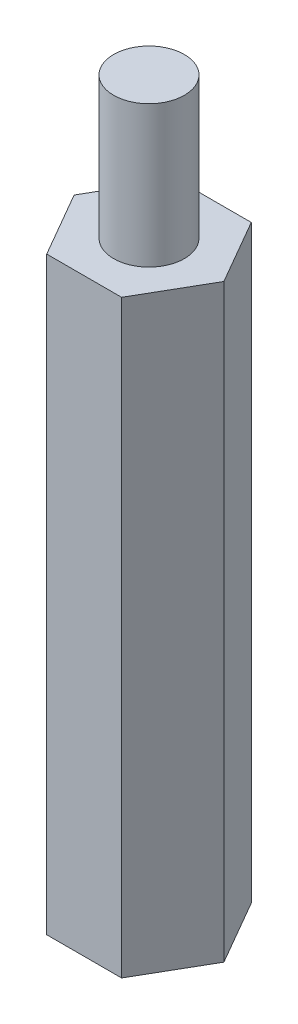
ISO-10303-21;
HEADER;
FILE_DESCRIPTION(('STEP AP214'),'2;1');
FILE_NAME('part.step','',(''),(''),'','','');
FILE_SCHEMA(('AUTOMOTIVE_DESIGN { 1 0 10303 214 1 1 1 1 }'));
ENDSEC;
DATA;
#1=APPLICATION_CONTEXT('core data for automotive mechanical design processes');
#2=APPLICATION_PROTOCOL_DEFINITION('international standard','automotive_design',2000,#1);
#3=PRODUCT_CONTEXT('',#1,'mechanical');
#4=PRODUCT('Part','Part','',(#3));
#5=PRODUCT_RELATED_PRODUCT_CATEGORY('part','',(#4));
#6=PRODUCT_DEFINITION_FORMATION('','',#4);
#7=PRODUCT_DEFINITION_CONTEXT('part definition',#1,'design');
#8=PRODUCT_DEFINITION('design','',#6,#7);
#9=PRODUCT_DEFINITION_SHAPE('','',#8);
#10=(LENGTH_UNIT() NAMED_UNIT(*) SI_UNIT(.MILLI.,.METRE.));
#11=(NAMED_UNIT(*) PLANE_ANGLE_UNIT() SI_UNIT($,.RADIAN.));
#12=(NAMED_UNIT(*) SI_UNIT($,.STERADIAN.) SOLID_ANGLE_UNIT());
#13=UNCERTAINTY_MEASURE_WITH_UNIT(LENGTH_MEASURE(1.E-05),#10,'distance_accuracy_value','');
#14=(GEOMETRIC_REPRESENTATION_CONTEXT(3) GLOBAL_UNCERTAINTY_ASSIGNED_CONTEXT((#13)) GLOBAL_UNIT_ASSIGNED_CONTEXT((#10,
#11,#12)) REPRESENTATION_CONTEXT('',''));
#15=CARTESIAN_POINT('',(0.,0.,0.));
#16=DIRECTION('',(0.,0.,1.));
#17=DIRECTION('',(1.,0.,0.));
#18=AXIS2_PLACEMENT_3D('',#15,#16,#17);
#19=CARTESIAN_POINT('',(0.,25.,0.));
#20=DIRECTION('',(0.,1.,0.));
#21=DIRECTION('',(0.,0.,1.));
#22=AXIS2_PLACEMENT_3D('',#19,#20,#21);
#23=PLANE('',#22);
#24=DIRECTION('',(1.,0.,0.));
#25=VECTOR('',#24,1.);
#26=CARTESIAN_POINT('',(-1.58771324027147,25.,2.75));
#27=LINE('',#26,#25);
#28=CARTESIAN_POINT('',(-1.58771324027147,25.,2.75));
#29=VERTEX_POINT('',#28);
#30=CARTESIAN_POINT('',(1.58771324027147,25.,2.75));
#31=VERTEX_POINT('',#30);
#32=EDGE_CURVE('E136',#29,#31,#27,.T.);
#33=ORIENTED_EDGE('',*,*,#32,.T.);
#34=DIRECTION('',(0.5,0.,-0.866025403784439));
#35=VECTOR('',#34,1.);
#36=CARTESIAN_POINT('',(1.58771324027147,25.,2.75));
#37=LINE('',#36,#35);
#38=CARTESIAN_POINT('',(3.17542648054294,25.,0.));
#39=VERTEX_POINT('',#38);
#40=EDGE_CURVE('E93',#31,#39,#37,.T.);
#41=ORIENTED_EDGE('',*,*,#40,.T.);
#42=DIRECTION('',(-0.5,0.,-0.866025403784439));
#43=VECTOR('',#42,1.);
#44=CARTESIAN_POINT('',(3.17542648054294,25.,0.));
#45=LINE('',#44,#43);
#46=CARTESIAN_POINT('',(1.58771324027147,25.,-2.75));
#47=VERTEX_POINT('',#46);
#48=EDGE_CURVE('E107',#39,#47,#45,.T.);
#49=ORIENTED_EDGE('',*,*,#48,.T.);
#50=DIRECTION('',(-1.,0.,0.));
#51=VECTOR('',#50,1.);
#52=CARTESIAN_POINT('',(1.58771324027147,25.,-2.75));
#53=LINE('',#52,#51);
#54=CARTESIAN_POINT('',(-1.58771324027147,25.,-2.75));
#55=VERTEX_POINT('',#54);
#56=EDGE_CURVE('E101',#47,#55,#53,.T.);
#57=ORIENTED_EDGE('',*,*,#56,.T.);
#58=DIRECTION('',(-0.5,0.,0.866025403784439));
#59=VECTOR('',#58,1.);
#60=CARTESIAN_POINT('',(-1.58771324027147,25.,-2.75));
#61=LINE('',#60,#59);
#62=CARTESIAN_POINT('',(-3.17542648054294,25.,0.));
#63=VERTEX_POINT('',#62);
#64=EDGE_CURVE('E105',#55,#63,#61,.T.);
#65=ORIENTED_EDGE('',*,*,#64,.T.);
#66=DIRECTION('',(0.5,0.,0.866025403784439));
#67=VECTOR('',#66,1.);
#68=CARTESIAN_POINT('',(-3.17542648054294,25.,0.));
#69=LINE('',#68,#67);
#70=EDGE_CURVE('E55',#63,#29,#69,.T.);
#71=ORIENTED_EDGE('',*,*,#70,.T.);
#72=EDGE_LOOP('',(#33,#41,#49,#57,#65,#71));
#73=FACE_BOUND('',#72,.T.);
#74=CARTESIAN_POINT('',(0.,25.,0.));
#75=DIRECTION('',(0.,1.,0.));
#76=DIRECTION('',(0.,0.,1.));
#77=AXIS2_PLACEMENT_3D('',#74,#75,#76);
#78=CIRCLE('',#77,1.5);
#79=CARTESIAN_POINT('',(0.,25.,1.5));
#80=VERTEX_POINT('',#79);
#81=EDGE_CURVE('E191',#80,#80,#78,.T.);
#82=ORIENTED_EDGE('',*,*,#81,.F.);
#83=EDGE_LOOP('',(#82));
#84=FACE_BOUND('',#83,.T.);
#85=ADVANCED_FACE('F38',(#73,#84),#23,.T.);
#86=CARTESIAN_POINT('',(-1.58771324027147,25.,2.75));
#87=DIRECTION('',(0.,0.,-1.));
#88=DIRECTION('',(-1.,0.,0.));
#89=AXIS2_PLACEMENT_3D('',#86,#87,#88);
#90=PLANE('',#89);
#91=DIRECTION('',(1.,0.,0.));
#92=VECTOR('',#91,1.);
#93=CARTESIAN_POINT('',(-1.58771324027147,0.,2.75));
#94=LINE('',#93,#92);
#95=CARTESIAN_POINT('',(-1.58771324027147,0.,2.75));
#96=VERTEX_POINT('',#95);
#97=CARTESIAN_POINT('',(1.58771324027147,0.,2.75));
#98=VERTEX_POINT('',#97);
#99=EDGE_CURVE('E125',#96,#98,#94,.T.);
#100=ORIENTED_EDGE('',*,*,#99,.T.);
#101=DIRECTION('',(0.,-1.,0.));
#102=VECTOR('',#101,1.);
#103=CARTESIAN_POINT('',(1.58771324027147,25.,2.75));
#104=LINE('',#103,#102);
#105=EDGE_CURVE('E11',#31,#98,#104,.T.);
#106=ORIENTED_EDGE('',*,*,#105,.F.);
#107=ORIENTED_EDGE('',*,*,#32,.F.);
#108=DIRECTION('',(0.,-1.,0.));
#109=VECTOR('',#108,1.);
#110=CARTESIAN_POINT('',(-1.58771324027147,25.,2.75));
#111=LINE('',#110,#109);
#112=EDGE_CURVE('E121',#29,#96,#111,.T.);
#113=ORIENTED_EDGE('',*,*,#112,.T.);
#114=EDGE_LOOP('',(#100,#106,#107,#113));
#115=FACE_BOUND('',#114,.T.);
#116=ADVANCED_FACE('F40',(#115),#90,.F.);
#117=CARTESIAN_POINT('',(1.58771324027147,25.,2.75));
#118=DIRECTION('',(-0.866025403784439,0.,-0.5));
#119=DIRECTION('',(-0.5,0.,0.866025403784439));
#120=AXIS2_PLACEMENT_3D('',#117,#118,#119);
#121=PLANE('',#120);
#122=DIRECTION('',(0.5,0.,-0.866025403784439));
#123=VECTOR('',#122,1.);
#124=CARTESIAN_POINT('',(1.58771324027147,0.,2.75));
#125=LINE('',#124,#123);
#126=CARTESIAN_POINT('',(3.17542648054294,0.,0.));
#127=VERTEX_POINT('',#126);
#128=EDGE_CURVE('E128',#98,#127,#125,.T.);
#129=ORIENTED_EDGE('',*,*,#128,.T.);
#130=DIRECTION('',(0.,-1.,0.));
#131=VECTOR('',#130,1.);
#132=CARTESIAN_POINT('',(3.17542648054294,25.,0.));
#133=LINE('',#132,#131);
#134=EDGE_CURVE('E47',#39,#127,#133,.T.);
#135=ORIENTED_EDGE('',*,*,#134,.F.);
#136=ORIENTED_EDGE('',*,*,#40,.F.);
#137=ORIENTED_EDGE('',*,*,#105,.T.);
#138=EDGE_LOOP('',(#129,#135,#136,#137));
#139=FACE_BOUND('',#138,.T.);
#140=ADVANCED_FACE('F165',(#139),#121,.F.);
#141=CARTESIAN_POINT('',(3.17542648054294,25.,0.));
#142=DIRECTION('',(-0.866025403784439,0.,0.5));
#143=DIRECTION('',(0.5,0.,0.866025403784439));
#144=AXIS2_PLACEMENT_3D('',#141,#142,#143);
#145=PLANE('',#144);
#146=DIRECTION('',(-0.5,0.,-0.866025403784439));
#147=VECTOR('',#146,1.);
#148=CARTESIAN_POINT('',(3.17542648054294,0.,0.));
#149=LINE('',#148,#147);
#150=CARTESIAN_POINT('',(1.58771324027147,0.,-2.75));
#151=VERTEX_POINT('',#150);
#152=EDGE_CURVE('E131',#127,#151,#149,.T.);
#153=ORIENTED_EDGE('',*,*,#152,.T.);
#154=DIRECTION('',(0.,-1.,0.));
#155=VECTOR('',#154,1.);
#156=CARTESIAN_POINT('',(1.58771324027147,25.,-2.75));
#157=LINE('',#156,#155);
#158=EDGE_CURVE('E116',#47,#151,#157,.T.);
#159=ORIENTED_EDGE('',*,*,#158,.F.);
#160=ORIENTED_EDGE('',*,*,#48,.F.);
#161=ORIENTED_EDGE('',*,*,#134,.T.);
#162=EDGE_LOOP('',(#153,#159,#160,#161));
#163=FACE_BOUND('',#162,.T.);
#164=ADVANCED_FACE('F142',(#163),#145,.F.);
#165=CARTESIAN_POINT('',(1.58771324027147,25.,-2.75));
#166=DIRECTION('',(0.,0.,1.));
#167=DIRECTION('',(1.,0.,0.));
#168=AXIS2_PLACEMENT_3D('',#165,#166,#167);
#169=PLANE('',#168);
#170=DIRECTION('',(-1.,0.,0.));
#171=VECTOR('',#170,1.);
#172=CARTESIAN_POINT('',(1.58771324027147,0.,-2.75));
#173=LINE('',#172,#171);
#174=CARTESIAN_POINT('',(-1.58771324027147,0.,-2.75));
#175=VERTEX_POINT('',#174);
#176=EDGE_CURVE('E115',#151,#175,#173,.T.);
#177=ORIENTED_EDGE('',*,*,#176,.T.);
#178=DIRECTION('',(0.,-1.,0.));
#179=VECTOR('',#178,1.);
#180=CARTESIAN_POINT('',(-1.58771324027147,25.,-2.75));
#181=LINE('',#180,#179);
#182=EDGE_CURVE('E112',#55,#175,#181,.T.);
#183=ORIENTED_EDGE('',*,*,#182,.F.);
#184=ORIENTED_EDGE('',*,*,#56,.F.);
#185=ORIENTED_EDGE('',*,*,#158,.T.);
#186=EDGE_LOOP('',(#177,#183,#184,#185));
#187=FACE_BOUND('',#186,.T.);
#188=ADVANCED_FACE('F113',(#187),#169,.F.);
#189=CARTESIAN_POINT('',(-1.58771324027147,25.,-2.75));
#190=DIRECTION('',(0.866025403784439,0.,0.5));
#191=DIRECTION('',(0.5,0.,-0.866025403784439));
#192=AXIS2_PLACEMENT_3D('',#189,#190,#191);
#193=PLANE('',#192);
#194=DIRECTION('',(-0.5,0.,0.866025403784439));
#195=VECTOR('',#194,1.);
#196=CARTESIAN_POINT('',(-1.58771324027147,0.,-2.75));
#197=LINE('',#196,#195);
#198=CARTESIAN_POINT('',(-3.17542648054294,0.,0.));
#199=VERTEX_POINT('',#198);
#200=EDGE_CURVE('E79',#175,#199,#197,.T.);
#201=ORIENTED_EDGE('',*,*,#200,.T.);
#202=DIRECTION('',(0.,-1.,0.));
#203=VECTOR('',#202,1.);
#204=CARTESIAN_POINT('',(-3.17542648054294,25.,0.));
#205=LINE('',#204,#203);
#206=EDGE_CURVE('E117',#63,#199,#205,.T.);
#207=ORIENTED_EDGE('',*,*,#206,.F.);
#208=ORIENTED_EDGE('',*,*,#64,.F.);
#209=ORIENTED_EDGE('',*,*,#182,.T.);
#210=EDGE_LOOP('',(#201,#207,#208,#209));
#211=FACE_BOUND('',#210,.T.);
#212=ADVANCED_FACE('F119',(#211),#193,.F.);
#213=CARTESIAN_POINT('',(-3.17542648054294,25.,0.));
#214=DIRECTION('',(0.866025403784439,0.,-0.5));
#215=DIRECTION('',(-0.5,0.,-0.866025403784439));
#216=AXIS2_PLACEMENT_3D('',#213,#214,#215);
#217=PLANE('',#216);
#218=DIRECTION('',(0.5,0.,0.866025403784439));
#219=VECTOR('',#218,1.);
#220=CARTESIAN_POINT('',(-3.17542648054294,0.,0.));
#221=LINE('',#220,#219);
#222=EDGE_CURVE('E85',#199,#96,#221,.T.);
#223=ORIENTED_EDGE('',*,*,#222,.T.);
#224=ORIENTED_EDGE('',*,*,#112,.F.);
#225=ORIENTED_EDGE('',*,*,#70,.F.);
#226=ORIENTED_EDGE('',*,*,#206,.T.);
#227=EDGE_LOOP('',(#223,#224,#225,#226));
#228=FACE_BOUND('',#227,.T.);
#229=ADVANCED_FACE('F149',(#228),#217,.F.);
#230=CARTESIAN_POINT('',(0.,0.,0.));
#231=DIRECTION('',(0.,1.,0.));
#232=DIRECTION('',(0.,0.,1.));
#233=AXIS2_PLACEMENT_3D('',#230,#231,#232);
#234=PLANE('',#233);
#235=CARTESIAN_POINT('',(0.,0.,0.));
#236=DIRECTION('',(0.,-1.,0.));
#237=DIRECTION('',(0.,0.,-1.));
#238=AXIS2_PLACEMENT_3D('',#235,#236,#237);
#239=CIRCLE('',#238,1.25);
#240=CARTESIAN_POINT('',(0.,0.,-1.25));
#241=VERTEX_POINT('',#240);
#242=EDGE_CURVE('E189',#241,#241,#239,.T.);
#243=ORIENTED_EDGE('',*,*,#242,.F.);
#244=EDGE_LOOP('',(#243));
#245=FACE_BOUND('',#244,.T.);
#246=ORIENTED_EDGE('',*,*,#99,.F.);
#247=ORIENTED_EDGE('',*,*,#222,.F.);
#248=ORIENTED_EDGE('',*,*,#200,.F.);
#249=ORIENTED_EDGE('',*,*,#176,.F.);
#250=ORIENTED_EDGE('',*,*,#152,.F.);
#251=ORIENTED_EDGE('',*,*,#128,.F.);
#252=EDGE_LOOP('',(#246,#247,#248,#249,#250,#251));
#253=FACE_BOUND('',#252,.T.);
#254=ADVANCED_FACE('F145',(#245,#253),#234,.F.);
#255=CARTESIAN_POINT('',(0.,31.,0.));
#256=DIRECTION('',(0.,-1.,0.));
#257=DIRECTION('',(0.,0.,-1.));
#258=AXIS2_PLACEMENT_3D('',#255,#256,#257);
#259=CYLINDRICAL_SURFACE('',#258,1.5);
#260=CARTESIAN_POINT('',(0.,31.,0.));
#261=DIRECTION('',(0.,1.,0.));
#262=DIRECTION('',(0.,0.,1.));
#263=AXIS2_PLACEMENT_3D('',#260,#261,#262);
#264=CIRCLE('',#263,1.5);
#265=CARTESIAN_POINT('',(0.,31.,1.5));
#266=VERTEX_POINT('',#265);
#267=EDGE_CURVE('E129',#266,#266,#264,.T.);
#268=ORIENTED_EDGE('',*,*,#267,.F.);
#269=EDGE_LOOP('',(#268));
#270=FACE_BOUND('',#269,.T.);
#271=ORIENTED_EDGE('',*,*,#81,.T.);
#272=EDGE_LOOP('',(#271));
#273=FACE_BOUND('',#272,.T.);
#274=ADVANCED_FACE('F156',(#270,#273),#259,.T.);
#275=CARTESIAN_POINT('',(0.,31.,0.));
#276=DIRECTION('',(0.,1.,0.));
#277=DIRECTION('',(0.,0.,1.));
#278=AXIS2_PLACEMENT_3D('',#275,#276,#277);
#279=PLANE('',#278);
#280=ORIENTED_EDGE('',*,*,#267,.T.);
#281=EDGE_LOOP('',(#280));
#282=FACE_BOUND('',#281,.T.);
#283=ADVANCED_FACE('F169',(#282),#279,.T.);
#284=CARTESIAN_POINT('',(0.,8.5,0.));
#285=DIRECTION('',(0.,-1.,0.));
#286=DIRECTION('',(0.,0.,-1.));
#287=AXIS2_PLACEMENT_3D('',#284,#285,#286);
#288=CONICAL_SURFACE('',#287,1.25,1.02974425867665);
#289=CARTESIAN_POINT('',(0.,9.25107577378445,0.));
#290=VERTEX_POINT('',#289);
#291=VERTEX_LOOP('',#290);
#292=FACE_BOUND('',#291,.T.);
#293=CARTESIAN_POINT('',(0.,8.5,0.));
#294=DIRECTION('',(0.,-1.,0.));
#295=DIRECTION('',(0.,0.,-1.));
#296=AXIS2_PLACEMENT_3D('',#293,#294,#295);
#297=CIRCLE('',#296,1.25);
#298=CARTESIAN_POINT('',(0.,8.5,-1.25));
#299=VERTEX_POINT('',#298);
#300=EDGE_CURVE('E186',#299,#299,#297,.T.);
#301=ORIENTED_EDGE('',*,*,#300,.T.);
#302=EDGE_LOOP('',(#301));
#303=FACE_BOUND('',#302,.T.);
#304=ADVANCED_FACE('F173',(#292,#303),#288,.F.);
#305=CARTESIAN_POINT('',(0.,0.,0.));
#306=DIRECTION('',(0.,-1.,0.));
#307=DIRECTION('',(0.,0.,-1.));
#308=AXIS2_PLACEMENT_3D('',#305,#306,#307);
#309=CYLINDRICAL_SURFACE('',#308,1.25);
#310=ORIENTED_EDGE('',*,*,#300,.F.);
#311=EDGE_LOOP('',(#310));
#312=FACE_BOUND('',#311,.T.);
#313=ORIENTED_EDGE('',*,*,#242,.T.);
#314=EDGE_LOOP('',(#313));
#315=FACE_BOUND('',#314,.T.);
#316=ADVANCED_FACE('F177',(#312,#315),#309,.F.);
#317=CLOSED_SHELL('',(#85,#116,#140,#164,#188,#212,#229,#254,#274,#283,#304,#316));
#318=MANIFOLD_SOLID_BREP('B2',#317);
#319=ADVANCED_BREP_SHAPE_REPRESENTATION('',(#18,#318),#14);
#320=SHAPE_DEFINITION_REPRESENTATION(#9,#319);
ENDSEC;
END-ISO-10303-21;
